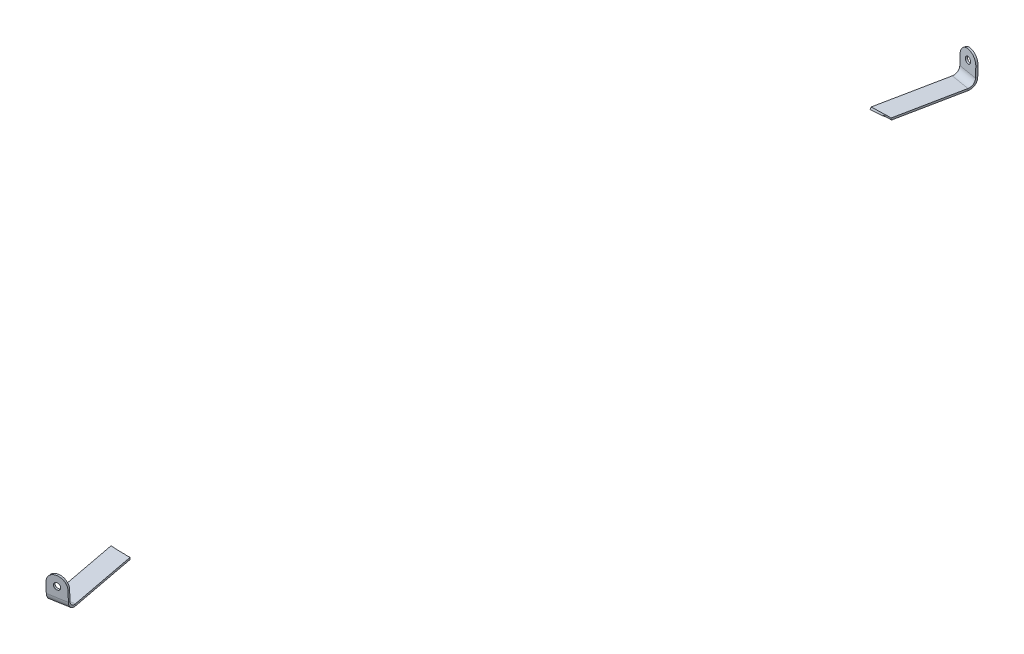
ISO-10303-21;
HEADER;
FILE_DESCRIPTION(('STEP AP214'),'2;1');
FILE_NAME('part.step','',(''),(''),'','','');
FILE_SCHEMA(('AUTOMOTIVE_DESIGN { 1 0 10303 214 1 1 1 1 }'));
ENDSEC;
DATA;
#1=APPLICATION_CONTEXT('core data for automotive mechanical design processes');
#2=APPLICATION_PROTOCOL_DEFINITION('international standard','automotive_design',2000,#1);
#3=PRODUCT_CONTEXT('',#1,'mechanical');
#4=PRODUCT('Part','Part','',(#3));
#5=PRODUCT_RELATED_PRODUCT_CATEGORY('part','',(#4));
#6=PRODUCT_DEFINITION_FORMATION('','',#4);
#7=PRODUCT_DEFINITION_CONTEXT('part definition',#1,'design');
#8=PRODUCT_DEFINITION('design','',#6,#7);
#9=PRODUCT_DEFINITION_SHAPE('','',#8);
#10=(LENGTH_UNIT() NAMED_UNIT(*) SI_UNIT(.MILLI.,.METRE.));
#11=(NAMED_UNIT(*) PLANE_ANGLE_UNIT() SI_UNIT($,.RADIAN.));
#12=(NAMED_UNIT(*) SI_UNIT($,.STERADIAN.) SOLID_ANGLE_UNIT());
#13=UNCERTAINTY_MEASURE_WITH_UNIT(LENGTH_MEASURE(1.E-05),#10,'distance_accuracy_value','');
#14=(GEOMETRIC_REPRESENTATION_CONTEXT(3) GLOBAL_UNCERTAINTY_ASSIGNED_CONTEXT((#13)) GLOBAL_UNIT_ASSIGNED_CONTEXT((#10,
#11,#12)) REPRESENTATION_CONTEXT('',''));
#15=CARTESIAN_POINT('',(0.,0.,0.));
#16=DIRECTION('',(0.,0.,1.));
#17=DIRECTION('',(1.,0.,0.));
#18=AXIS2_PLACEMENT_3D('',#15,#16,#17);
#19=CARTESIAN_POINT('',(-454.575221179992,354.525423143221,240.500641187299));
#20=DIRECTION('',(0.0609657391469297,-0.985926788350095,0.155664853656615));
#21=DIRECTION('',(0.,0.155954951815569,0.987764168718528));
#22=AXIS2_PLACEMENT_3D('',#19,#20,#21);
#23=CYLINDRICAL_SURFACE('',#22,12.7);
#24=CARTESIAN_POINT('',(-437.155744575564,72.8208319473103,284.978085639631));
#25=DIRECTION('',(0.,0.999631046205767,0.0271619487806516));
#26=DIRECTION('',(0.317023420960302,-0.0257608732319121,0.948067786591738));
#27=AXIS2_PLACEMENT_3D('',#24,#25,#26);
#28=ELLIPSE('',#27,12.9415558727378,12.7);
#29=CARTESIAN_POINT('',(-435.134039824026,72.473815444945,297.74920424056));
#30=VERTEX_POINT('',#29);
#31=CARTESIAN_POINT('',(-439.015321000394,72.4743381705257,297.729966566488));
#32=VERTEX_POINT('',#31);
#33=EDGE_CURVE('E166',#30,#32,#28,.F.);
#34=ORIENTED_EDGE('',*,*,#33,.F.);
#35=CARTESIAN_POINT('',(-437.14716187275,72.6820340463752,285.));
#36=DIRECTION('',(-0.68633491047864,-0.720841644542401,0.0966007978832687));
#37=DIRECTION('',(0.726913662599448,-0.675658315797391,0.122810290367253));
#38=AXIS2_PLACEMENT_3D('',#35,#36,#37);
#39=ELLIPSE('',#38,18.5701965904078,12.7000000000001);
#40=CARTESIAN_POINT('',(-434.743022917673,72.1011972708238,297.746821817143));
#41=VERTEX_POINT('',#40);
#42=EDGE_CURVE('E80',#30,#41,#39,.F.);
#43=ORIENTED_EDGE('',*,*,#42,.T.);
#44=CARTESIAN_POINT('',(-436.638137968157,64.4501925158768,286.29969935122));
#45=DIRECTION('',(-0.98607036337252,-0.00451781179628869,0.166267338509281));
#46=DIRECTION('',(0.0316142938172328,-0.986498873323067,0.16068761420457));
#47=AXIS2_PLACEMENT_3D('',#44,#45,#46);
#48=ELLIPSE('',#47,426.456473639011,12.7);
#49=CARTESIAN_POINT('',(-434.706648450076,70.9683013451794,297.931762372394));
#50=VERTEX_POINT('',#49);
#51=EDGE_CURVE('E244',#41,#50,#48,.F.);
#52=ORIENTED_EDGE('',*,*,#51,.T.);
#53=CARTESIAN_POINT('',(-437.062556600821,71.3138130554369,285.216024072823));
#54=DIRECTION('',(0.,0.999631046205767,0.0271619487806516));
#55=DIRECTION('',(0.317023420960302,-0.0257608732319121,0.948067786591738));
#56=AXIS2_PLACEMENT_3D('',#53,#54,#55);
#57=ELLIPSE('',#56,12.9415558727378,12.7);
#58=CARTESIAN_POINT('',(-440.880925780828,70.9803334096441,297.488950802206));
#59=VERTEX_POINT('',#58);
#60=EDGE_CURVE('E177',#50,#59,#57,.F.);
#61=ORIENTED_EDGE('',*,*,#60,.T.);
#62=CARTESIAN_POINT('',(-437.147161872749,72.6820340463746,285.));
#63=DIRECTION('',(-0.617048223658441,0.783072263279084,-0.077777375649579));
#64=DIRECTION('',(-0.782914510019822,-0.600931102063593,0.161017640564808));
#65=AXIS2_PLACEMENT_3D('',#62,#63,#64);
#66=ELLIPSE('',#65,15.4542968259917,12.7);
#67=EDGE_CURVE('E172',#32,#59,#66,.F.);
#68=ORIENTED_EDGE('',*,*,#67,.F.);
#69=EDGE_LOOP('',(#34,#43,#52,#61,#68));
#70=FACE_BOUND('',#69,.T.);
#71=ADVANCED_FACE('F71',(#70),#23,.F.);
#72=CARTESIAN_POINT('',(-425.21405512395,69.4397272385906,354.187303744331));
#73=DIRECTION('',(0.98607036337252,0.00451781179628869,-0.166267338509281));
#74=DIRECTION('',(0.166269035345273,0.,0.986080426681999));
#75=AXIS2_PLACEMENT_3D('',#72,#73,#74);
#76=PLANE('',#75);
#77=DIRECTION('',(-0.166328706116492,0.0267835927040429,-0.985706548970574));
#78=VECTOR('',#77,1.);
#79=CARTESIAN_POINT('',(-471.210528296626,78.3458977104861,81.6411559590432));
#80=LINE('',#79,#78);
#81=CARTESIAN_POINT('',(-434.742774799832,72.4735652713372,297.758411286322));
#82=VERTEX_POINT('',#81);
#83=CARTESIAN_POINT('',(-426.045698654532,71.0730917714194,349.29951392265));
#84=VERTEX_POINT('',#83);
#85=EDGE_CURVE('E162',#82,#84,#80,.F.);
#86=ORIENTED_EDGE('',*,*,#85,.T.);
#87=DIRECTION('',(0.,-0.999631046205767,-0.0271619487806516));
#88=VECTOR('',#87,1.);
#89=CARTESIAN_POINT('',(-426.045698654532,71.0730917714195,349.29951392265));
#90=LINE('',#89,#88);
#91=CARTESIAN_POINT('',(-426.045698654532,69.5736452021108,349.258770999479));
#92=VERTEX_POINT('',#91);
#93=EDGE_CURVE('E195',#84,#92,#90,.T.);
#94=ORIENTED_EDGE('',*,*,#93,.T.);
#95=DIRECTION('',(0.166328706116492,-0.0267835927040429,0.985706548970574));
#96=VECTOR('',#95,1.);
#97=CARTESIAN_POINT('',(-425.21405512395,69.4397272385906,354.187303744331));
#98=LINE('',#97,#96);
#99=EDGE_CURVE('E255',#50,#92,#98,.T.);
#100=ORIENTED_EDGE('',*,*,#99,.F.);
#101=ORIENTED_EDGE('',*,*,#51,.F.);
#102=CARTESIAN_POINT('',(-436.893998540833,72.6820411849469,285.005960083017));
#103=DIRECTION('',(-0.98607036337252,-0.00451781179628869,0.166267338509281));
#104=DIRECTION('',(0.166327674183448,-0.0232621817616968,0.985796112642168));
#105=AXIS2_PLACEMENT_3D('',#102,#103,#104);
#106=ELLIPSE('',#105,12.9343169742472,12.7000000000001);
#107=EDGE_CURVE('E174',#82,#41,#106,.F.);
#108=ORIENTED_EDGE('',*,*,#107,.F.);
#109=EDGE_LOOP('',(#86,#94,#100,#101,#108));
#110=FACE_BOUND('',#109,.T.);
#111=ADVANCED_FACE('F252',(#110),#76,.T.);
#112=CARTESIAN_POINT('',(0.,80.5048110724018,2.18747463200989));
#113=DIRECTION('',(0.,-0.999631046205767,-0.0271619487806516));
#114=DIRECTION('',(0.,-0.0271619487806516,0.999631046205767));
#115=AXIS2_PLACEMENT_3D('',#112,#113,#114);
#116=PLANE('',#115);
#117=CARTESIAN_POINT('',(-437.583576476735,72.8198902261302,285.012743452152));
#118=DIRECTION('',(0.,0.999631046205767,0.0271619487806516));
#119=DIRECTION('',(0.99978769088877,0.000559676648990314,-0.020597570472012));
#120=AXIS2_PLACEMENT_3D('',#117,#118,#119);
#121=ELLIPSE('',#120,42.0890580143291,12.7);
#122=CARTESIAN_POINT('',(-450.019155275822,72.4839490528952,297.376260855724));
#123=VERTEX_POINT('',#122);
#124=EDGE_CURVE('E14',#32,#123,#121,.F.);
#125=ORIENTED_EDGE('',*,*,#124,.T.);
#126=DIRECTION('',(0.166328706116492,-0.0267835927040429,0.985706548970574));
#127=VECTOR('',#126,1.);
#128=CARTESIAN_POINT('',(-486.001583747213,78.2781305335418,84.1351660366824));
#129=LINE('',#128,#127);
#130=CARTESIAN_POINT('',(-440.83675410512,71.0053245944751,351.793524000289));
#131=VERTEX_POINT('',#130);
#132=EDGE_CURVE('E155',#131,#123,#129,.F.);
#133=ORIENTED_EDGE('',*,*,#132,.F.);
#134=DIRECTION('',(-0.98607036337252,-0.00451781179628871,0.166267338509281));
#135=VECTOR('',#134,1.);
#136=CARTESIAN_POINT('',(-440.83675410512,71.0053245944751,351.793524000289));
#137=LINE('',#136,#135);
#138=EDGE_CURVE('E185',#131,#84,#137,.F.);
#139=ORIENTED_EDGE('',*,*,#138,.T.);
#140=ORIENTED_EDGE('',*,*,#85,.F.);
#141=CARTESIAN_POINT('',(-230.223854808945,72.6878687651985,289.87147992127));
#142=DIRECTION('',(0.,0.999631046205767,0.0271619487806516));
#143=DIRECTION('',(0.999723214152043,-0.000639024943334067,0.0235177960836197));
#144=AXIS2_PLACEMENT_3D('',#141,#142,#143);
#145=ELLIPSE('',#144,19027.3361564429,12.7000000000001);
#146=EDGE_CURVE('E168',#82,#30,#145,.F.);
#147=ORIENTED_EDGE('',*,*,#146,.T.);
#148=ORIENTED_EDGE('',*,*,#33,.T.);
#149=EDGE_LOOP('',(#125,#133,#139,#140,#147,#148));
#150=FACE_BOUND('',#149,.T.);
#151=ADVANCED_FACE('F73',(#150),#116,.F.);
#152=CARTESIAN_POINT('',(-424.964562064775,83.7771333763223,356.05653083898));
#153=DIRECTION('',(0.98607036337252,0.00451781179628892,-0.166267338509281));
#154=DIRECTION('',(0.,-0.999631046205767,-0.0271619487806558));
#155=AXIS2_PLACEMENT_3D('',#152,#153,#154);
#156=PLANE('',#155);
#157=DIRECTION('',(0.,-0.999631046205767,-0.0271619487806558));
#158=VECTOR('',#157,1.);
#159=CARTESIAN_POINT('',(-425.21405512395,83.8173087653783,354.577971015524));
#160=LINE('',#159,#158);
#161=CARTESIAN_POINT('',(-425.21405512395,83.8173087653783,354.577971015524));
#162=VERTEX_POINT('',#161);
#163=CARTESIAN_POINT('',(-425.21405512395,75.9373290389281,354.363856411406));
#164=VERTEX_POINT('',#163);
#165=EDGE_CURVE('E161',#162,#164,#160,.T.);
#166=ORIENTED_EDGE('',*,*,#165,.F.);
#167=DIRECTION('',(0.166328706116492,-0.0267835927040463,0.985706548970573));
#168=VECTOR('',#167,1.);
#169=CARTESIAN_POINT('',(-424.964562064775,83.7771333763223,356.05653083898));
#170=LINE('',#169,#168);
#171=CARTESIAN_POINT('',(-424.964562064775,83.7771333763223,356.05653083898));
#172=VERTEX_POINT('',#171);
#173=EDGE_CURVE('E215',#162,#172,#170,.T.);
#174=ORIENTED_EDGE('',*,*,#173,.T.);
#175=DIRECTION('',(0.,-0.999631046205767,-0.0271619487806558));
#176=VECTOR('',#175,1.);
#177=CARTESIAN_POINT('',(-424.964562064775,83.7771333763223,356.05653083898));
#178=LINE('',#177,#176);
#179=CARTESIAN_POINT('',(-424.964562064775,75.897153649872,355.842416234862));
#180=VERTEX_POINT('',#179);
#181=EDGE_CURVE('E191',#172,#180,#178,.T.);
#182=ORIENTED_EDGE('',*,*,#181,.T.);
#183=DIRECTION('',(0.166328706116496,-0.0267835927040465,0.985706548970573));
#184=VECTOR('',#183,1.);
#185=CARTESIAN_POINT('',(-425.21405512395,75.9373290389281,354.363856411406));
#186=LINE('',#185,#184);
#187=EDGE_CURVE('E209',#164,#180,#186,.T.);
#188=ORIENTED_EDGE('',*,*,#187,.F.);
#189=EDGE_LOOP('',(#166,#174,#182,#188));
#190=FACE_BOUND('',#189,.T.);
#191=ADVANCED_FACE('F285',(#190),#156,.T.);
#192=CARTESIAN_POINT('',(-432.360089790069,83.7432497878501,357.303535877799));
#193=DIRECTION('',(0.166328706116492,-0.0267835927040463,0.985706548970573));
#194=DIRECTION('',(-0.986060292941571,0.,0.166388397083397));
#195=AXIS2_PLACEMENT_3D('',#192,#193,#194);
#196=PLANE('',#195);
#197=CARTESIAN_POINT('',(-432.360089790069,83.7432497878501,357.303535877799));
#198=DIRECTION('',(-0.166328706116492,0.0267835927040463,-0.985706548970573));
#199=DIRECTION('',(-0.986060292941571,0.,0.166388397083397));
#200=AXIS2_PLACEMENT_3D('',#197,#198,#199);
#201=CIRCLE('',#200,2.5);
#202=CARTESIAN_POINT('',(-434.825240522423,83.7432497878501,357.719506870508));
#203=VERTEX_POINT('',#202);
#204=EDGE_CURVE('E208',#203,#203,#201,.T.);
#205=ORIENTED_EDGE('',*,*,#204,.T.);
#206=EDGE_LOOP('',(#205));
#207=FACE_BOUND('',#206,.T.);
#208=ORIENTED_EDGE('',*,*,#181,.F.);
#209=CARTESIAN_POINT('',(-432.360089790069,83.7432497878501,357.303535877799));
#210=DIRECTION('',(-0.166328706116492,0.0267835927040463,-0.985706548970573));
#211=DIRECTION('',(-0.986060292941571,0.,0.166388397083397));
#212=AXIS2_PLACEMENT_3D('',#209,#210,#211);
#213=CIRCLE('',#212,7.49999999999999);
#214=CARTESIAN_POINT('',(-439.755617515363,83.7093661993779,358.550540916619));
#215=VERTEX_POINT('',#214);
#216=EDGE_CURVE('E216',#215,#172,#213,.T.);
#217=ORIENTED_EDGE('',*,*,#216,.F.);
#218=DIRECTION('',(0.,0.999631046205767,0.0271619487806558));
#219=VECTOR('',#218,1.);
#220=CARTESIAN_POINT('',(-439.755617515363,69.3317846725901,358.159873645426));
#221=LINE('',#220,#219);
#222=CARTESIAN_POINT('',(-439.755617515363,75.8293864729277,358.336426312501));
#223=VERTEX_POINT('',#222);
#224=EDGE_CURVE('E190',#223,#215,#221,.T.);
#225=ORIENTED_EDGE('',*,*,#224,.F.);
#226=DIRECTION('',(0.986070363372519,0.004517811796289,-0.166267338509284));
#227=VECTOR('',#226,1.);
#228=CARTESIAN_POINT('',(-424.964562064775,75.897153649872,355.842416234862));
#229=LINE('',#228,#227);
#230=EDGE_CURVE('E187',#180,#223,#229,.F.);
#231=ORIENTED_EDGE('',*,*,#230,.F.);
#232=EDGE_LOOP('',(#208,#217,#225,#231));
#233=FACE_BOUND('',#232,.T.);
#234=ADVANCED_FACE('F289',(#207,#233),#196,.T.);
#235=CARTESIAN_POINT('',(-432.609582849244,83.7834251769061,355.824976054343));
#236=DIRECTION('',(0.166328706116492,-0.0267835927040463,0.985706548970573));
#237=DIRECTION('',(-0.986060292941571,0.,0.166388397083397));
#238=AXIS2_PLACEMENT_3D('',#235,#236,#237);
#239=PLANE('',#238);
#240=CARTESIAN_POINT('',(-432.609582849244,83.7834251769061,355.824976054343));
#241=DIRECTION('',(-0.166328706116492,0.0267835927040463,-0.985706548970573));
#242=DIRECTION('',(-0.986060292941571,0.,0.166388397083397));
#243=AXIS2_PLACEMENT_3D('',#240,#241,#242);
#244=CIRCLE('',#243,2.5);
#245=CARTESIAN_POINT('',(-435.074733581598,83.7834251769061,356.240947047052));
#246=VERTEX_POINT('',#245);
#247=EDGE_CURVE('E219',#246,#246,#244,.T.);
#248=ORIENTED_EDGE('',*,*,#247,.F.);
#249=EDGE_LOOP('',(#248));
#250=FACE_BOUND('',#249,.T.);
#251=DIRECTION('',(0.986070363372519,0.004517811796289,-0.166267338509284));
#252=VECTOR('',#251,1.);
#253=CARTESIAN_POINT('',(-425.21405512395,75.9373290389281,354.363856411406));
#254=LINE('',#253,#252);
#255=CARTESIAN_POINT('',(-440.005110574538,75.8695618619837,356.857866489045));
#256=VERTEX_POINT('',#255);
#257=EDGE_CURVE('E199',#164,#256,#254,.F.);
#258=ORIENTED_EDGE('',*,*,#257,.T.);
#259=DIRECTION('',(0.,0.999631046205767,0.0271619487806558));
#260=VECTOR('',#259,1.);
#261=CARTESIAN_POINT('',(-440.005110574538,69.3719600616462,356.681313821971));
#262=LINE('',#261,#260);
#263=CARTESIAN_POINT('',(-440.005110574538,83.749541588434,357.071981093163));
#264=VERTEX_POINT('',#263);
#265=EDGE_CURVE('E229',#256,#264,#262,.T.);
#266=ORIENTED_EDGE('',*,*,#265,.T.);
#267=CARTESIAN_POINT('',(-432.609582849244,83.7834251769061,355.824976054343));
#268=DIRECTION('',(-0.166328706116492,0.0267835927040463,-0.985706548970573));
#269=DIRECTION('',(-0.986060292941571,0.,0.166388397083397));
#270=AXIS2_PLACEMENT_3D('',#267,#268,#269);
#271=CIRCLE('',#270,7.49999999999999);
#272=EDGE_CURVE('E230',#264,#162,#271,.T.);
#273=ORIENTED_EDGE('',*,*,#272,.T.);
#274=ORIENTED_EDGE('',*,*,#165,.T.);
#275=EDGE_LOOP('',(#258,#266,#273,#274));
#276=FACE_BOUND('',#275,.T.);
#277=ADVANCED_FACE('F280',(#250,#276),#239,.F.);
#278=CARTESIAN_POINT('',(-439.755617515363,69.3317846725901,358.159873645426));
#279=DIRECTION('',(-0.98607036337252,-0.00451781179628892,0.166267338509281));
#280=DIRECTION('',(0.,0.999631046205767,0.0271619487806558));
#281=AXIS2_PLACEMENT_3D('',#278,#279,#280);
#282=PLANE('',#281);
#283=DIRECTION('',(0.166328706116496,-0.0267835927040455,0.985706548970573));
#284=VECTOR('',#283,1.);
#285=CARTESIAN_POINT('',(-440.005110574538,75.8695618619837,356.857866489045));
#286=LINE('',#285,#284);
#287=EDGE_CURVE('E196',#256,#223,#286,.T.);
#288=ORIENTED_EDGE('',*,*,#287,.T.);
#289=ORIENTED_EDGE('',*,*,#224,.T.);
#290=DIRECTION('',(0.166328706116492,-0.0267835927040463,0.985706548970573));
#291=VECTOR('',#290,1.);
#292=CARTESIAN_POINT('',(-439.755617515363,83.7093661993779,358.550540916619));
#293=LINE('',#292,#291);
#294=EDGE_CURVE('E233',#264,#215,#293,.T.);
#295=ORIENTED_EDGE('',*,*,#294,.F.);
#296=ORIENTED_EDGE('',*,*,#265,.F.);
#297=EDGE_LOOP('',(#288,#289,#295,#296));
#298=FACE_BOUND('',#297,.T.);
#299=ADVANCED_FACE('F276',(#298),#282,.T.);
#300=CARTESIAN_POINT('',(-432.360089790069,83.7432497878501,357.303535877799));
#301=DIRECTION('',(0.166328706116492,-0.0267835927040463,0.985706548970573));
#302=DIRECTION('',(-0.986060292941571,0.,0.166388397083397));
#303=AXIS2_PLACEMENT_3D('',#300,#301,#302);
#304=CYLINDRICAL_SURFACE('',#303,7.49999999999999);
#305=ORIENTED_EDGE('',*,*,#294,.T.);
#306=ORIENTED_EDGE('',*,*,#216,.T.);
#307=ORIENTED_EDGE('',*,*,#173,.F.);
#308=ORIENTED_EDGE('',*,*,#272,.F.);
#309=EDGE_LOOP('',(#305,#306,#307,#308));
#310=FACE_BOUND('',#309,.T.);
#311=ADVANCED_FACE('F291',(#310),#304,.T.);
#312=CARTESIAN_POINT('',(-432.360089790069,83.7432497878501,357.303535877799));
#313=DIRECTION('',(0.166328706116492,-0.0267835927040463,0.985706548970573));
#314=DIRECTION('',(-0.986060292941571,0.,0.166388397083397));
#315=AXIS2_PLACEMENT_3D('',#312,#313,#314);
#316=CYLINDRICAL_SURFACE('',#315,2.5);
#317=ORIENTED_EDGE('',*,*,#204,.F.);
#318=EDGE_LOOP('',(#317));
#319=FACE_BOUND('',#318,.T.);
#320=ORIENTED_EDGE('',*,*,#247,.T.);
#321=EDGE_LOOP('',(#320));
#322=FACE_BOUND('',#321,.T.);
#323=ADVANCED_FACE('F293',(#319,#322),#316,.F.);
#324=CARTESIAN_POINT('',(-440.83675410512,76.003479825504,351.929333744192));
#325=DIRECTION('',(-0.986070363372519,-0.004517811796289,0.166267338509284));
#326=DIRECTION('',(-0.166269035345277,0.,-0.986080426681998));
#327=AXIS2_PLACEMENT_3D('',#324,#325,#326);
#328=PLANE('',#327);
#329=DIRECTION('',(0.,-0.999631046205767,-0.0271619487806516));
#330=VECTOR('',#329,1.);
#331=CARTESIAN_POINT('',(-440.83675410512,69.5058780251665,351.752781077118));
#332=LINE('',#331,#330);
#333=CARTESIAN_POINT('',(-440.83675410512,69.5058780251665,351.752781077118));
#334=VERTEX_POINT('',#333);
#335=EDGE_CURVE('E151',#131,#334,#332,.T.);
#336=ORIENTED_EDGE('',*,*,#335,.T.);
#337=CARTESIAN_POINT('',(-440.83675410512,76.003479825504,351.929333744192));
#338=DIRECTION('',(-0.986070363372519,-0.004517811796289,0.166267338509284));
#339=DIRECTION('',(0.166269035345277,0.,0.986080426681998));
#340=AXIS2_PLACEMENT_3D('',#337,#338,#339);
#341=CIRCLE('',#340,6.5);
#342=EDGE_CURVE('E192',#223,#334,#341,.F.);
#343=ORIENTED_EDGE('',*,*,#342,.F.);
#344=ORIENTED_EDGE('',*,*,#287,.F.);
#345=CARTESIAN_POINT('',(-440.83675410512,76.003479825504,351.929333744192));
#346=DIRECTION('',(-0.986070363372519,-0.004517811796289,0.166267338509284));
#347=DIRECTION('',(0.166269035345277,0.,0.986080426681998));
#348=AXIS2_PLACEMENT_3D('',#345,#346,#347);
#349=CIRCLE('',#348,5.);
#350=EDGE_CURVE('E200',#256,#131,#349,.F.);
#351=ORIENTED_EDGE('',*,*,#350,.T.);
#352=EDGE_LOOP('',(#336,#343,#344,#351));
#353=FACE_BOUND('',#352,.T.);
#354=ADVANCED_FACE('F273',(#353),#328,.T.);
#355=CARTESIAN_POINT('',(-426.045698654532,76.0712470024483,349.435323666553));
#356=DIRECTION('',(-0.986070363372519,-0.004517811796289,0.166267338509284));
#357=DIRECTION('',(-0.166269035345277,0.,-0.986080426681998));
#358=AXIS2_PLACEMENT_3D('',#355,#356,#357);
#359=PLANE('',#358);
#360=CARTESIAN_POINT('',(-426.045698654532,76.0712470024483,349.435323666553));
#361=DIRECTION('',(-0.986070363372519,-0.004517811796289,0.166267338509284));
#362=DIRECTION('',(0.166269035345277,0.,0.986080426681998));
#363=AXIS2_PLACEMENT_3D('',#360,#361,#362);
#364=CIRCLE('',#363,5.);
#365=EDGE_CURVE('E204',#84,#164,#364,.T.);
#366=ORIENTED_EDGE('',*,*,#365,.T.);
#367=ORIENTED_EDGE('',*,*,#187,.T.);
#368=CARTESIAN_POINT('',(-426.045698654532,76.0712470024483,349.435323666553));
#369=DIRECTION('',(-0.986070363372519,-0.004517811796289,0.166267338509284));
#370=DIRECTION('',(0.166269035345277,0.,0.986080426681998));
#371=AXIS2_PLACEMENT_3D('',#368,#369,#370);
#372=CIRCLE('',#371,6.5);
#373=EDGE_CURVE('E197',#92,#180,#372,.T.);
#374=ORIENTED_EDGE('',*,*,#373,.F.);
#375=ORIENTED_EDGE('',*,*,#93,.F.);
#376=EDGE_LOOP('',(#366,#367,#374,#375));
#377=FACE_BOUND('',#376,.T.);
#378=ADVANCED_FACE('F263',(#377),#359,.F.);
#379=CARTESIAN_POINT('',(-426.045698654532,76.0712470024483,349.435323666553));
#380=DIRECTION('',(0.986070363372519,0.004517811796289,-0.166267338509284));
#381=DIRECTION('',(0.,-0.999631046205768,-0.0271619487806517));
#382=AXIS2_PLACEMENT_3D('',#379,#380,#381);
#383=CYLINDRICAL_SURFACE('',#382,6.5);
#384=ORIENTED_EDGE('',*,*,#230,.T.);
#385=ORIENTED_EDGE('',*,*,#342,.T.);
#386=DIRECTION('',(0.98607036337252,0.00451781179628871,-0.166267338509281));
#387=VECTOR('',#386,1.);
#388=CARTESIAN_POINT('',(45.1648296420933,71.7325585640264,269.805089672445));
#389=LINE('',#388,#387);
#390=EDGE_CURVE('E180',#334,#92,#389,.T.);
#391=ORIENTED_EDGE('',*,*,#390,.T.);
#392=ORIENTED_EDGE('',*,*,#373,.T.);
#393=EDGE_LOOP('',(#384,#385,#391,#392));
#394=FACE_BOUND('',#393,.T.);
#395=ADVANCED_FACE('F270',(#394),#383,.T.);
#396=CARTESIAN_POINT('',(-426.045698654532,76.0712470024483,349.435323666553));
#397=DIRECTION('',(0.986070363372519,0.004517811796289,-0.166267338509284));
#398=DIRECTION('',(0.,-0.999631046205768,-0.0271619487806517));
#399=AXIS2_PLACEMENT_3D('',#396,#397,#398);
#400=CYLINDRICAL_SURFACE('',#399,5.);
#401=ORIENTED_EDGE('',*,*,#257,.F.);
#402=ORIENTED_EDGE('',*,*,#365,.F.);
#403=ORIENTED_EDGE('',*,*,#138,.F.);
#404=ORIENTED_EDGE('',*,*,#350,.F.);
#405=EDGE_LOOP('',(#401,#402,#403,#404));
#406=FACE_BOUND('',#405,.T.);
#407=ADVANCED_FACE('F283',(#406),#400,.F.);
#408=CARTESIAN_POINT('',(-453.560900123032,71.5548228670257,276.346230080869));
#409=DIRECTION('',(-0.98607036337252,-0.00451781179628869,0.166267338509281));
#410=DIRECTION('',(-0.166269035345273,0.,-0.986080426681999));
#411=AXIS2_PLACEMENT_3D('',#408,#409,#410);
#412=PLANE('',#411);
#413=DIRECTION('',(-0.166328706116492,0.0267835927040429,-0.985706548970574));
#414=VECTOR('',#413,1.);
#415=CARTESIAN_POINT('',(-453.560900123032,71.5548228670257,276.346230080869));
#416=LINE('',#415,#414);
#417=CARTESIAN_POINT('',(-450.113376353857,70.9996747231665,296.777139671586));
#418=VERTEX_POINT('',#417);
#419=EDGE_CURVE('E75',#334,#418,#416,.T.);
#420=ORIENTED_EDGE('',*,*,#419,.F.);
#421=ORIENTED_EDGE('',*,*,#335,.F.);
#422=ORIENTED_EDGE('',*,*,#132,.T.);
#423=CARTESIAN_POINT('',(-452.055074028709,77.3911977617537,285.435316012605));
#424=DIRECTION('',(0.98607036337252,0.00451781179628869,-0.166267338509281));
#425=DIRECTION('',(0.0696626886194012,-0.918949393737597,0.388174086671971));
#426=AXIS2_PLACEMENT_3D('',#423,#424,#425);
#427=ELLIPSE('',#426,13.4651231277329,12.7);
#428=EDGE_CURVE('E147',#418,#123,#427,.F.);
#429=ORIENTED_EDGE('',*,*,#428,.F.);
#430=EDGE_LOOP('',(#420,#421,#422,#429));
#431=FACE_BOUND('',#430,.T.);
#432=ADVANCED_FACE('F156',(#431),#412,.T.);
#433=CARTESIAN_POINT('',(0.,79.0053645030931,2.14673170883891));
#434=DIRECTION('',(0.,-0.999631046205767,-0.0271619487806516));
#435=DIRECTION('',(0.,-0.0271619487806516,0.999631046205767));
#436=AXIS2_PLACEMENT_3D('',#433,#434,#435);
#437=PLANE('',#436);
#438=ORIENTED_EDGE('',*,*,#60,.F.);
#439=ORIENTED_EDGE('',*,*,#99,.T.);
#440=ORIENTED_EDGE('',*,*,#390,.F.);
#441=ORIENTED_EDGE('',*,*,#419,.T.);
#442=CARTESIAN_POINT('',(-432.845139883224,71.3230962122974,284.87437952149));
#443=DIRECTION('',(0.,0.999631046205767,0.0271619487806516));
#444=DIRECTION('',(0.99978769088877,0.000559676648990314,-0.020597570472012));
#445=AXIS2_PLACEMENT_3D('',#442,#443,#444);
#446=ELLIPSE('',#445,42.0890580143291,12.7);
#447=EDGE_CURVE('E95',#59,#418,#446,.F.);
#448=ORIENTED_EDGE('',*,*,#447,.F.);
#449=EDGE_LOOP('',(#438,#439,#440,#441,#448));
#450=FACE_BOUND('',#449,.T.);
#451=ADVANCED_FACE('F269',(#450),#437,.T.);
#452=CARTESIAN_POINT('',(-437.147161872751,72.6820340463752,285.));
#453=DIRECTION('',(0.999722991461748,2.81896836037487E-05,0.0235359203796016));
#454=DIRECTION('',(-0.0235359203889531,0.,0.999722991858968));
#455=AXIS2_PLACEMENT_3D('',#452,#453,#454);
#456=CYLINDRICAL_SURFACE('',#455,12.7000000000001);
#457=ORIENTED_EDGE('',*,*,#146,.F.);
#458=ORIENTED_EDGE('',*,*,#107,.T.);
#459=ORIENTED_EDGE('',*,*,#42,.F.);
#460=EDGE_LOOP('',(#457,#458,#459));
#461=FACE_BOUND('',#460,.T.);
#462=ADVANCED_FACE('F248',(#461),#456,.F.);
#463=CARTESIAN_POINT('',(-676.260714615963,148.214063927805,291.982195578493));
#464=DIRECTION('',(0.953187480336007,-0.301096213164722,-0.0278333926886372));
#465=DIRECTION('',(0.301212910252048,0.953556911095238,0.));
#466=AXIS2_PLACEMENT_3D('',#463,#464,#465);
#467=CYLINDRICAL_SURFACE('',#466,12.7);
#468=ORIENTED_EDGE('',*,*,#124,.F.);
#469=ORIENTED_EDGE('',*,*,#67,.T.);
#470=ORIENTED_EDGE('',*,*,#447,.T.);
#471=ORIENTED_EDGE('',*,*,#428,.T.);
#472=EDGE_LOOP('',(#468,#469,#470,#471));
#473=FACE_BOUND('',#472,.T.);
#474=ADVANCED_FACE('F149',(#473),#467,.F.);
#475=CLOSED_SHELL('',(#71,#111,#151,#191,#234,#277,#299,#311,#323,#354,#378,#395,#407,#432,#451,
#462,#474));
#476=MANIFOLD_SOLID_BREP('B2',#475);
#477=CARTESIAN_POINT('',(-454.575221179992,354.525423143221,-240.500641187299));
#478=DIRECTION('',(0.0609657391469297,-0.985926788350095,-0.155664853656615));
#479=DIRECTION('',(0.,0.155954951815569,-0.987764168718528));
#480=AXIS2_PLACEMENT_3D('',#477,#478,#479);
#481=CYLINDRICAL_SURFACE('',#480,12.7);
#482=CARTESIAN_POINT('',(-437.155744575564,72.8208319473103,-284.978085639631));
#483=DIRECTION('',(0.,-0.999631046205767,0.0271619487806516));
#484=DIRECTION('',(0.317023420960302,-0.0257608732319121,-0.948067786591738));
#485=AXIS2_PLACEMENT_3D('',#482,#483,#484);
#486=ELLIPSE('',#485,12.9415558727378,12.7);
#487=CARTESIAN_POINT('',(-435.134039824026,72.473815444945,-297.74920424056));
#488=VERTEX_POINT('',#487);
#489=CARTESIAN_POINT('',(-439.015321000394,72.4743381705257,-297.729966566488));
#490=VERTEX_POINT('',#489);
#491=EDGE_CURVE('E600',#488,#490,#486,.F.);
#492=ORIENTED_EDGE('',*,*,#491,.T.);
#493=CARTESIAN_POINT('',(-437.147161872749,72.6820340463746,-285.));
#494=DIRECTION('',(0.617048223658441,-0.783072263279084,-0.077777375649579));
#495=DIRECTION('',(-0.782914510019822,-0.600931102063593,-0.161017640564808));
#496=AXIS2_PLACEMENT_3D('',#493,#494,#495);
#497=ELLIPSE('',#496,15.4542968259917,12.7);
#498=CARTESIAN_POINT('',(-440.880925780828,70.9803334096441,-297.488950802206));
#499=VERTEX_POINT('',#498);
#500=EDGE_CURVE('E514',#490,#499,#497,.F.);
#501=ORIENTED_EDGE('',*,*,#500,.T.);
#502=CARTESIAN_POINT('',(-437.062556600821,71.3138130554369,-285.216024072823));
#503=DIRECTION('',(0.,-0.999631046205767,0.0271619487806516));
#504=DIRECTION('',(0.317023420960302,-0.0257608732319121,-0.948067786591738));
#505=AXIS2_PLACEMENT_3D('',#502,#503,#504);
#506=ELLIPSE('',#505,12.9415558727378,12.7);
#507=CARTESIAN_POINT('',(-434.706648450076,70.9683013451794,-297.931762372394));
#508=VERTEX_POINT('',#507);
#509=EDGE_CURVE('E602',#508,#499,#506,.F.);
#510=ORIENTED_EDGE('',*,*,#509,.F.);
#511=CARTESIAN_POINT('',(-436.638137968157,64.4501925158768,-286.29969935122));
#512=DIRECTION('',(0.98607036337252,0.00451781179628869,0.166267338509281));
#513=DIRECTION('',(0.0316142938172328,-0.986498873323067,-0.16068761420457));
#514=AXIS2_PLACEMENT_3D('',#511,#512,#513);
#515=ELLIPSE('',#514,426.456473639011,12.7);
#516=CARTESIAN_POINT('',(-434.743022917673,72.1011972708238,-297.746821817143));
#517=VERTEX_POINT('',#516);
#518=EDGE_CURVE('E669',#517,#508,#515,.F.);
#519=ORIENTED_EDGE('',*,*,#518,.F.);
#520=CARTESIAN_POINT('',(-437.14716187275,72.6820340463752,-285.));
#521=DIRECTION('',(0.68633491047864,0.720841644542401,0.0966007978832687));
#522=DIRECTION('',(0.726913662599448,-0.675658315797391,-0.122810290367253));
#523=AXIS2_PLACEMENT_3D('',#520,#521,#522);
#524=ELLIPSE('',#523,18.5701965904078,12.7000000000001);
#525=EDGE_CURVE('E507',#488,#517,#524,.F.);
#526=ORIENTED_EDGE('',*,*,#525,.F.);
#527=EDGE_LOOP('',(#492,#501,#510,#519,#526));
#528=FACE_BOUND('',#527,.T.);
#529=ADVANCED_FACE('F498',(#528),#481,.F.);
#530=CARTESIAN_POINT('',(-425.21405512395,69.4397272385906,-354.187303744331));
#531=DIRECTION('',(0.98607036337252,0.00451781179628869,0.166267338509281));
#532=DIRECTION('',(0.166269035345273,0.,-0.986080426681999));
#533=AXIS2_PLACEMENT_3D('',#530,#531,#532);
#534=PLANE('',#533);
#535=DIRECTION('',(-0.166328706116492,0.0267835927040429,0.985706548970574));
#536=VECTOR('',#535,1.);
#537=CARTESIAN_POINT('',(-471.210528296626,78.3458977104861,-81.6411559590432));
#538=LINE('',#537,#536);
#539=CARTESIAN_POINT('',(-434.742774799832,72.4735652713372,-297.758411286322));
#540=VERTEX_POINT('',#539);
#541=CARTESIAN_POINT('',(-426.045698654532,71.0730917714194,-349.29951392265));
#542=VERTEX_POINT('',#541);
#543=EDGE_CURVE('E591',#540,#542,#538,.F.);
#544=ORIENTED_EDGE('',*,*,#543,.F.);
#545=CARTESIAN_POINT('',(-436.893998540833,72.6820411849469,-285.005960083017));
#546=DIRECTION('',(0.98607036337252,0.00451781179628869,0.166267338509281));
#547=DIRECTION('',(0.166327674183448,-0.0232621817616968,-0.985796112642168));
#548=AXIS2_PLACEMENT_3D('',#545,#546,#547);
#549=ELLIPSE('',#548,12.9343169742472,12.7000000000001);
#550=EDGE_CURVE('E666',#540,#517,#549,.F.);
#551=ORIENTED_EDGE('',*,*,#550,.T.);
#552=ORIENTED_EDGE('',*,*,#518,.T.);
#553=DIRECTION('',(0.166328706116492,-0.0267835927040429,-0.985706548970574));
#554=VECTOR('',#553,1.);
#555=CARTESIAN_POINT('',(-425.21405512395,69.4397272385906,-354.187303744331));
#556=LINE('',#555,#554);
#557=CARTESIAN_POINT('',(-426.045698654532,69.5736452021108,-349.258770999479));
#558=VERTEX_POINT('',#557);
#559=EDGE_CURVE('E597',#508,#558,#556,.T.);
#560=ORIENTED_EDGE('',*,*,#559,.T.);
#561=DIRECTION('',(0.,-0.999631046205767,0.0271619487806516));
#562=VECTOR('',#561,1.);
#563=CARTESIAN_POINT('',(-426.045698654532,71.0730917714195,-349.29951392265));
#564=LINE('',#563,#562);
#565=EDGE_CURVE('E620',#542,#558,#564,.T.);
#566=ORIENTED_EDGE('',*,*,#565,.F.);
#567=EDGE_LOOP('',(#544,#551,#552,#560,#566));
#568=FACE_BOUND('',#567,.T.);
#569=ADVANCED_FACE('F680',(#568),#534,.T.);
#570=CARTESIAN_POINT('',(0.,80.5048110724018,-2.18747463200989));
#571=DIRECTION('',(0.,-0.999631046205767,0.0271619487806516));
#572=DIRECTION('',(0.,-0.0271619487806516,-0.999631046205767));
#573=AXIS2_PLACEMENT_3D('',#570,#571,#572);
#574=PLANE('',#573);
#575=CARTESIAN_POINT('',(-437.583576476735,72.8198902261302,-285.012743452152));
#576=DIRECTION('',(0.,-0.999631046205767,0.0271619487806516));
#577=DIRECTION('',(0.99978769088877,0.000559676648990314,0.020597570472012));
#578=AXIS2_PLACEMENT_3D('',#575,#576,#577);
#579=ELLIPSE('',#578,42.0890580143291,12.7);
#580=CARTESIAN_POINT('',(-450.019155275822,72.4839490528952,-297.376260855724));
#581=VERTEX_POINT('',#580);
#582=EDGE_CURVE('E69',#490,#581,#579,.F.);
#583=ORIENTED_EDGE('',*,*,#582,.F.);
#584=ORIENTED_EDGE('',*,*,#491,.F.);
#585=CARTESIAN_POINT('',(-230.223854808945,72.6878687651985,-289.87147992127));
#586=DIRECTION('',(0.,-0.999631046205767,0.0271619487806516));
#587=DIRECTION('',(0.999723214152043,-0.000639024943334067,-0.0235177960836197));
#588=AXIS2_PLACEMENT_3D('',#585,#586,#587);
#589=ELLIPSE('',#588,19027.3361564429,12.7000000000001);
#590=EDGE_CURVE('E670',#540,#488,#589,.F.);
#591=ORIENTED_EDGE('',*,*,#590,.F.);
#592=ORIENTED_EDGE('',*,*,#543,.T.);
#593=DIRECTION('',(-0.98607036337252,-0.00451781179628871,-0.166267338509281));
#594=VECTOR('',#593,1.);
#595=CARTESIAN_POINT('',(-440.83675410512,71.0053245944751,-351.793524000289));
#596=LINE('',#595,#594);
#597=CARTESIAN_POINT('',(-440.83675410512,71.0053245944751,-351.793524000289));
#598=VERTEX_POINT('',#597);
#599=EDGE_CURVE('E589',#598,#542,#596,.F.);
#600=ORIENTED_EDGE('',*,*,#599,.F.);
#601=DIRECTION('',(0.166328706116492,-0.0267835927040429,-0.985706548970574));
#602=VECTOR('',#601,1.);
#603=CARTESIAN_POINT('',(-486.001583747213,78.2781305335418,-84.1351660366824));
#604=LINE('',#603,#602);
#605=EDGE_CURVE('E583',#598,#581,#604,.F.);
#606=ORIENTED_EDGE('',*,*,#605,.T.);
#607=EDGE_LOOP('',(#583,#584,#591,#592,#600,#606));
#608=FACE_BOUND('',#607,.T.);
#609=ADVANCED_FACE('F500',(#608),#574,.F.);
#610=CARTESIAN_POINT('',(-424.964562064775,83.7771333763223,-356.05653083898));
#611=DIRECTION('',(0.98607036337252,0.00451781179628892,0.166267338509281));
#612=DIRECTION('',(0.,-0.999631046205767,0.0271619487806558));
#613=AXIS2_PLACEMENT_3D('',#610,#611,#612);
#614=PLANE('',#613);
#615=DIRECTION('',(0.,-0.999631046205767,0.0271619487806558));
#616=VECTOR('',#615,1.);
#617=CARTESIAN_POINT('',(-425.21405512395,83.8173087653783,-354.577971015524));
#618=LINE('',#617,#616);
#619=CARTESIAN_POINT('',(-425.21405512395,83.8173087653783,-354.577971015524));
#620=VERTEX_POINT('',#619);
#621=CARTESIAN_POINT('',(-425.21405512395,75.9373290389281,-354.363856411406));
#622=VERTEX_POINT('',#621);
#623=EDGE_CURVE('E590',#620,#622,#618,.T.);
#624=ORIENTED_EDGE('',*,*,#623,.T.);
#625=DIRECTION('',(0.166328706116496,-0.0267835927040465,-0.985706548970573));
#626=VECTOR('',#625,1.);
#627=CARTESIAN_POINT('',(-425.21405512395,75.9373290389281,-354.363856411406));
#628=LINE('',#627,#626);
#629=CARTESIAN_POINT('',(-424.964562064775,75.897153649872,-355.842416234862));
#630=VERTEX_POINT('',#629);
#631=EDGE_CURVE('E595',#622,#630,#628,.T.);
#632=ORIENTED_EDGE('',*,*,#631,.T.);
#633=DIRECTION('',(0.,-0.999631046205767,0.0271619487806558));
#634=VECTOR('',#633,1.);
#635=CARTESIAN_POINT('',(-424.964562064775,83.7771333763223,-356.05653083898));
#636=LINE('',#635,#634);
#637=CARTESIAN_POINT('',(-424.964562064775,83.7771333763223,-356.05653083898));
#638=VERTEX_POINT('',#637);
#639=EDGE_CURVE('E616',#638,#630,#636,.T.);
#640=ORIENTED_EDGE('',*,*,#639,.F.);
#641=DIRECTION('',(0.166328706116492,-0.0267835927040463,-0.985706548970573));
#642=VECTOR('',#641,1.);
#643=CARTESIAN_POINT('',(-424.964562064775,83.7771333763223,-356.05653083898));
#644=LINE('',#643,#642);
#645=EDGE_CURVE('E641',#620,#638,#644,.T.);
#646=ORIENTED_EDGE('',*,*,#645,.F.);
#647=EDGE_LOOP('',(#624,#632,#640,#646));
#648=FACE_BOUND('',#647,.T.);
#649=ADVANCED_FACE('F711',(#648),#614,.T.);
#650=CARTESIAN_POINT('',(-432.360089790069,83.7432497878501,-357.303535877799));
#651=DIRECTION('',(0.166328706116492,-0.0267835927040463,-0.985706548970573));
#652=DIRECTION('',(-0.986060292941571,0.,-0.166388397083397));
#653=AXIS2_PLACEMENT_3D('',#650,#651,#652);
#654=PLANE('',#653);
#655=CARTESIAN_POINT('',(-432.360089790069,83.7432497878501,-357.303535877799));
#656=DIRECTION('',(0.166328706116492,-0.0267835927040463,-0.985706548970573));
#657=DIRECTION('',(-0.986060292941571,0.,-0.166388397083397));
#658=AXIS2_PLACEMENT_3D('',#655,#656,#657);
#659=CIRCLE('',#658,2.5);
#660=CARTESIAN_POINT('',(-434.825240522423,83.7432497878501,-357.719506870508));
#661=VERTEX_POINT('',#660);
#662=EDGE_CURVE('E635',#661,#661,#659,.T.);
#663=ORIENTED_EDGE('',*,*,#662,.F.);
#664=EDGE_LOOP('',(#663));
#665=FACE_BOUND('',#664,.T.);
#666=ORIENTED_EDGE('',*,*,#639,.T.);
#667=DIRECTION('',(0.986070363372519,0.004517811796289,0.166267338509284));
#668=VECTOR('',#667,1.);
#669=CARTESIAN_POINT('',(-424.964562064775,75.897153649872,-355.842416234862));
#670=LINE('',#669,#668);
#671=CARTESIAN_POINT('',(-439.755617515363,75.8293864729277,-358.336426312501));
#672=VERTEX_POINT('',#671);
#673=EDGE_CURVE('E612',#630,#672,#670,.F.);
#674=ORIENTED_EDGE('',*,*,#673,.T.);
#675=DIRECTION('',(0.,0.999631046205767,-0.0271619487806558));
#676=VECTOR('',#675,1.);
#677=CARTESIAN_POINT('',(-439.755617515363,69.3317846725901,-358.159873645426));
#678=LINE('',#677,#676);
#679=CARTESIAN_POINT('',(-439.755617515363,83.7093661993779,-358.550540916619));
#680=VERTEX_POINT('',#679);
#681=EDGE_CURVE('E615',#672,#680,#678,.T.);
#682=ORIENTED_EDGE('',*,*,#681,.T.);
#683=CARTESIAN_POINT('',(-432.360089790069,83.7432497878501,-357.303535877799));
#684=DIRECTION('',(0.166328706116492,-0.0267835927040463,-0.985706548970573));
#685=DIRECTION('',(-0.986060292941571,0.,-0.166388397083397));
#686=AXIS2_PLACEMENT_3D('',#683,#684,#685);
#687=CIRCLE('',#686,7.49999999999999);
#688=EDGE_CURVE('E642',#680,#638,#687,.T.);
#689=ORIENTED_EDGE('',*,*,#688,.T.);
#690=EDGE_LOOP('',(#666,#674,#682,#689));
#691=FACE_BOUND('',#690,.T.);
#692=ADVANCED_FACE('F702',(#665,#691),#654,.T.);
#693=CARTESIAN_POINT('',(-432.609582849244,83.7834251769061,-355.824976054343));
#694=DIRECTION('',(0.166328706116492,-0.0267835927040463,-0.985706548970573));
#695=DIRECTION('',(-0.986060292941571,0.,-0.166388397083397));
#696=AXIS2_PLACEMENT_3D('',#693,#694,#695);
#697=PLANE('',#696);
#698=CARTESIAN_POINT('',(-432.609582849244,83.7834251769061,-355.824976054343));
#699=DIRECTION('',(0.166328706116492,-0.0267835927040463,-0.985706548970573));
#700=DIRECTION('',(-0.986060292941571,0.,-0.166388397083397));
#701=AXIS2_PLACEMENT_3D('',#698,#699,#700);
#702=CIRCLE('',#701,2.5);
#703=CARTESIAN_POINT('',(-435.074733581598,83.7834251769061,-356.240947047052));
#704=VERTEX_POINT('',#703);
#705=EDGE_CURVE('E646',#704,#704,#702,.T.);
#706=ORIENTED_EDGE('',*,*,#705,.T.);
#707=EDGE_LOOP('',(#706));
#708=FACE_BOUND('',#707,.T.);
#709=DIRECTION('',(0.986070363372519,0.004517811796289,0.166267338509284));
#710=VECTOR('',#709,1.);
#711=CARTESIAN_POINT('',(-425.21405512395,75.9373290389281,-354.363856411406));
#712=LINE('',#711,#710);
#713=CARTESIAN_POINT('',(-440.005110574538,75.8695618619837,-356.857866489045));
#714=VERTEX_POINT('',#713);
#715=EDGE_CURVE('E625',#622,#714,#712,.F.);
#716=ORIENTED_EDGE('',*,*,#715,.F.);
#717=ORIENTED_EDGE('',*,*,#623,.F.);
#718=CARTESIAN_POINT('',(-432.609582849244,83.7834251769061,-355.824976054343));
#719=DIRECTION('',(0.166328706116492,-0.0267835927040463,-0.985706548970573));
#720=DIRECTION('',(-0.986060292941571,0.,-0.166388397083397));
#721=AXIS2_PLACEMENT_3D('',#718,#719,#720);
#722=CIRCLE('',#721,7.49999999999999);
#723=CARTESIAN_POINT('',(-440.005110574538,83.749541588434,-357.071981093163));
#724=VERTEX_POINT('',#723);
#725=EDGE_CURVE('E656',#724,#620,#722,.T.);
#726=ORIENTED_EDGE('',*,*,#725,.F.);
#727=DIRECTION('',(0.,0.999631046205767,-0.0271619487806558));
#728=VECTOR('',#727,1.);
#729=CARTESIAN_POINT('',(-440.005110574538,69.3719600616462,-356.681313821971));
#730=LINE('',#729,#728);
#731=EDGE_CURVE('E655',#714,#724,#730,.T.);
#732=ORIENTED_EDGE('',*,*,#731,.F.);
#733=EDGE_LOOP('',(#716,#717,#726,#732));
#734=FACE_BOUND('',#733,.T.);
#735=ADVANCED_FACE('F717',(#708,#734),#697,.F.);
#736=CARTESIAN_POINT('',(-439.755617515363,69.3317846725901,-358.159873645426));
#737=DIRECTION('',(-0.98607036337252,-0.00451781179628892,-0.166267338509281));
#738=DIRECTION('',(0.,0.999631046205767,-0.0271619487806558));
#739=AXIS2_PLACEMENT_3D('',#736,#737,#738);
#740=PLANE('',#739);
#741=DIRECTION('',(0.166328706116496,-0.0267835927040455,-0.985706548970573));
#742=VECTOR('',#741,1.);
#743=CARTESIAN_POINT('',(-440.005110574538,75.8695618619837,-356.857866489045));
#744=LINE('',#743,#742);
#745=EDGE_CURVE('E621',#714,#672,#744,.T.);
#746=ORIENTED_EDGE('',*,*,#745,.F.);
#747=ORIENTED_EDGE('',*,*,#731,.T.);
#748=DIRECTION('',(0.166328706116492,-0.0267835927040463,-0.985706548970573));
#749=VECTOR('',#748,1.);
#750=CARTESIAN_POINT('',(-439.755617515363,83.7093661993779,-358.550540916619));
#751=LINE('',#750,#749);
#752=EDGE_CURVE('E660',#724,#680,#751,.T.);
#753=ORIENTED_EDGE('',*,*,#752,.T.);
#754=ORIENTED_EDGE('',*,*,#681,.F.);
#755=EDGE_LOOP('',(#746,#747,#753,#754));
#756=FACE_BOUND('',#755,.T.);
#757=ADVANCED_FACE('F704',(#756),#740,.T.);
#758=CARTESIAN_POINT('',(-432.360089790069,83.7432497878501,-357.303535877799));
#759=DIRECTION('',(0.166328706116492,-0.0267835927040463,-0.985706548970573));
#760=DIRECTION('',(-0.986060292941571,0.,-0.166388397083397));
#761=AXIS2_PLACEMENT_3D('',#758,#759,#760);
#762=CYLINDRICAL_SURFACE('',#761,7.49999999999999);
#763=ORIENTED_EDGE('',*,*,#752,.F.);
#764=ORIENTED_EDGE('',*,*,#725,.T.);
#765=ORIENTED_EDGE('',*,*,#645,.T.);
#766=ORIENTED_EDGE('',*,*,#688,.F.);
#767=EDGE_LOOP('',(#763,#764,#765,#766));
#768=FACE_BOUND('',#767,.T.);
#769=ADVANCED_FACE('F709',(#768),#762,.T.);
#770=CARTESIAN_POINT('',(-432.360089790069,83.7432497878501,-357.303535877799));
#771=DIRECTION('',(0.166328706116492,-0.0267835927040463,-0.985706548970573));
#772=DIRECTION('',(-0.986060292941571,0.,-0.166388397083397));
#773=AXIS2_PLACEMENT_3D('',#770,#771,#772);
#774=CYLINDRICAL_SURFACE('',#773,2.5);
#775=ORIENTED_EDGE('',*,*,#662,.T.);
#776=EDGE_LOOP('',(#775));
#777=FACE_BOUND('',#776,.T.);
#778=ORIENTED_EDGE('',*,*,#705,.F.);
#779=EDGE_LOOP('',(#778));
#780=FACE_BOUND('',#779,.T.);
#781=ADVANCED_FACE('F751',(#777,#780),#774,.F.);
#782=CARTESIAN_POINT('',(-440.83675410512,76.003479825504,-351.929333744192));
#783=DIRECTION('',(-0.986070363372519,-0.004517811796289,-0.166267338509284));
#784=DIRECTION('',(-0.166269035345277,0.,0.986080426681998));
#785=AXIS2_PLACEMENT_3D('',#782,#783,#784);
#786=PLANE('',#785);
#787=DIRECTION('',(0.,-0.999631046205767,0.0271619487806516));
#788=VECTOR('',#787,1.);
#789=CARTESIAN_POINT('',(-440.83675410512,69.5058780251665,-351.752781077118));
#790=LINE('',#789,#788);
#791=CARTESIAN_POINT('',(-440.83675410512,69.5058780251665,-351.752781077118));
#792=VERTEX_POINT('',#791);
#793=EDGE_CURVE('E585',#598,#792,#790,.T.);
#794=ORIENTED_EDGE('',*,*,#793,.F.);
#795=CARTESIAN_POINT('',(-440.83675410512,76.003479825504,-351.929333744192));
#796=DIRECTION('',(0.986070363372519,0.004517811796289,0.166267338509284));
#797=DIRECTION('',(0.166269035345277,0.,-0.986080426681998));
#798=AXIS2_PLACEMENT_3D('',#795,#796,#797);
#799=CIRCLE('',#798,5.);
#800=EDGE_CURVE('E626',#714,#598,#799,.F.);
#801=ORIENTED_EDGE('',*,*,#800,.F.);
#802=ORIENTED_EDGE('',*,*,#745,.T.);
#803=CARTESIAN_POINT('',(-440.83675410512,76.003479825504,-351.929333744192));
#804=DIRECTION('',(0.986070363372519,0.004517811796289,0.166267338509284));
#805=DIRECTION('',(0.166269035345277,0.,-0.986080426681998));
#806=AXIS2_PLACEMENT_3D('',#803,#804,#805);
#807=CIRCLE('',#806,6.5);
#808=EDGE_CURVE('E617',#672,#792,#807,.F.);
#809=ORIENTED_EDGE('',*,*,#808,.T.);
#810=EDGE_LOOP('',(#794,#801,#802,#809));
#811=FACE_BOUND('',#810,.T.);
#812=ADVANCED_FACE('F695',(#811),#786,.T.);
#813=CARTESIAN_POINT('',(-426.045698654532,76.0712470024483,-349.435323666553));
#814=DIRECTION('',(-0.986070363372519,-0.004517811796289,-0.166267338509284));
#815=DIRECTION('',(-0.166269035345277,0.,0.986080426681998));
#816=AXIS2_PLACEMENT_3D('',#813,#814,#815);
#817=PLANE('',#816);
#818=CARTESIAN_POINT('',(-426.045698654532,76.0712470024483,-349.435323666553));
#819=DIRECTION('',(0.986070363372519,0.004517811796289,0.166267338509284));
#820=DIRECTION('',(0.166269035345277,0.,-0.986080426681998));
#821=AXIS2_PLACEMENT_3D('',#818,#819,#820);
#822=CIRCLE('',#821,5.);
#823=EDGE_CURVE('E630',#542,#622,#822,.T.);
#824=ORIENTED_EDGE('',*,*,#823,.F.);
#825=ORIENTED_EDGE('',*,*,#565,.T.);
#826=CARTESIAN_POINT('',(-426.045698654532,76.0712470024483,-349.435323666553));
#827=DIRECTION('',(0.986070363372519,0.004517811796289,0.166267338509284));
#828=DIRECTION('',(0.166269035345277,0.,-0.986080426681998));
#829=AXIS2_PLACEMENT_3D('',#826,#827,#828);
#830=CIRCLE('',#829,6.5);
#831=EDGE_CURVE('E622',#558,#630,#830,.T.);
#832=ORIENTED_EDGE('',*,*,#831,.T.);
#833=ORIENTED_EDGE('',*,*,#631,.F.);
#834=EDGE_LOOP('',(#824,#825,#832,#833));
#835=FACE_BOUND('',#834,.T.);
#836=ADVANCED_FACE('F689',(#835),#817,.F.);
#837=CARTESIAN_POINT('',(-426.045698654532,76.0712470024483,-349.435323666553));
#838=DIRECTION('',(0.986070363372519,0.004517811796289,0.166267338509284));
#839=DIRECTION('',(0.,-0.999631046205768,0.0271619487806517));
#840=AXIS2_PLACEMENT_3D('',#837,#838,#839);
#841=CYLINDRICAL_SURFACE('',#840,6.5);
#842=ORIENTED_EDGE('',*,*,#673,.F.);
#843=ORIENTED_EDGE('',*,*,#831,.F.);
#844=DIRECTION('',(0.98607036337252,0.00451781179628871,0.166267338509281));
#845=VECTOR('',#844,1.);
#846=CARTESIAN_POINT('',(45.1648296420933,71.7325585640264,-269.805089672445));
#847=LINE('',#846,#845);
#848=EDGE_CURVE('E607',#792,#558,#847,.T.);
#849=ORIENTED_EDGE('',*,*,#848,.F.);
#850=ORIENTED_EDGE('',*,*,#808,.F.);
#851=EDGE_LOOP('',(#842,#843,#849,#850));
#852=FACE_BOUND('',#851,.T.);
#853=ADVANCED_FACE('F693',(#852),#841,.T.);
#854=CARTESIAN_POINT('',(-426.045698654532,76.0712470024483,-349.435323666553));
#855=DIRECTION('',(0.986070363372519,0.004517811796289,0.166267338509284));
#856=DIRECTION('',(0.,-0.999631046205768,0.0271619487806517));
#857=AXIS2_PLACEMENT_3D('',#854,#855,#856);
#858=CYLINDRICAL_SURFACE('',#857,5.);
#859=ORIENTED_EDGE('',*,*,#715,.T.);
#860=ORIENTED_EDGE('',*,*,#800,.T.);
#861=ORIENTED_EDGE('',*,*,#599,.T.);
#862=ORIENTED_EDGE('',*,*,#823,.T.);
#863=EDGE_LOOP('',(#859,#860,#861,#862));
#864=FACE_BOUND('',#863,.T.);
#865=ADVANCED_FACE('F715',(#864),#858,.F.);
#866=CARTESIAN_POINT('',(-453.560900123032,71.5548228670257,-276.346230080869));
#867=DIRECTION('',(-0.98607036337252,-0.00451781179628869,-0.166267338509281));
#868=DIRECTION('',(-0.166269035345273,0.,0.986080426681999));
#869=AXIS2_PLACEMENT_3D('',#866,#867,#868);
#870=PLANE('',#869);
#871=DIRECTION('',(-0.166328706116492,0.0267835927040429,0.985706548970574));
#872=VECTOR('',#871,1.);
#873=CARTESIAN_POINT('',(-453.560900123032,71.5548228670257,-276.346230080869));
#874=LINE('',#873,#872);
#875=CARTESIAN_POINT('',(-450.113376353857,70.9996747231665,-296.777139671586));
#876=VERTEX_POINT('',#875);
#877=EDGE_CURVE('E502',#792,#876,#874,.T.);
#878=ORIENTED_EDGE('',*,*,#877,.T.);
#879=CARTESIAN_POINT('',(-452.055074028709,77.3911977617537,-285.435316012605));
#880=DIRECTION('',(-0.98607036337252,-0.00451781179628869,-0.166267338509281));
#881=DIRECTION('',(0.0696626886194012,-0.918949393737597,-0.388174086671971));
#882=AXIS2_PLACEMENT_3D('',#879,#880,#881);
#883=ELLIPSE('',#882,13.4651231277329,12.7);
#884=EDGE_CURVE('E573',#876,#581,#883,.F.);
#885=ORIENTED_EDGE('',*,*,#884,.T.);
#886=ORIENTED_EDGE('',*,*,#605,.F.);
#887=ORIENTED_EDGE('',*,*,#793,.T.);
#888=EDGE_LOOP('',(#878,#885,#886,#887));
#889=FACE_BOUND('',#888,.T.);
#890=ADVANCED_FACE('F581',(#889),#870,.T.);
#891=CARTESIAN_POINT('',(0.,79.0053645030931,-2.14673170883891));
#892=DIRECTION('',(0.,-0.999631046205767,0.0271619487806516));
#893=DIRECTION('',(0.,-0.0271619487806516,-0.999631046205767));
#894=AXIS2_PLACEMENT_3D('',#891,#892,#893);
#895=PLANE('',#894);
#896=ORIENTED_EDGE('',*,*,#509,.T.);
#897=CARTESIAN_POINT('',(-432.845139883224,71.3230962122974,-284.87437952149));
#898=DIRECTION('',(0.,-0.999631046205767,0.0271619487806516));
#899=DIRECTION('',(0.99978769088877,0.000559676648990314,0.020597570472012));
#900=AXIS2_PLACEMENT_3D('',#897,#898,#899);
#901=ELLIPSE('',#900,42.0890580143291,12.7);
#902=EDGE_CURVE('E520',#499,#876,#901,.F.);
#903=ORIENTED_EDGE('',*,*,#902,.T.);
#904=ORIENTED_EDGE('',*,*,#877,.F.);
#905=ORIENTED_EDGE('',*,*,#848,.T.);
#906=ORIENTED_EDGE('',*,*,#559,.F.);
#907=EDGE_LOOP('',(#896,#903,#904,#905,#906));
#908=FACE_BOUND('',#907,.T.);
#909=ADVANCED_FACE('F691',(#908),#895,.T.);
#910=CARTESIAN_POINT('',(-437.147161872751,72.6820340463752,-285.));
#911=DIRECTION('',(0.999722991461748,2.81896836037487E-05,-0.0235359203796016));
#912=DIRECTION('',(-0.0235359203889531,0.,-0.999722991858968));
#913=AXIS2_PLACEMENT_3D('',#910,#911,#912);
#914=CYLINDRICAL_SURFACE('',#913,12.7000000000001);
#915=ORIENTED_EDGE('',*,*,#590,.T.);
#916=ORIENTED_EDGE('',*,*,#525,.T.);
#917=ORIENTED_EDGE('',*,*,#550,.F.);
#918=EDGE_LOOP('',(#915,#916,#917));
#919=FACE_BOUND('',#918,.T.);
#920=ADVANCED_FACE('F674',(#919),#914,.F.);
#921=CARTESIAN_POINT('',(-676.260714615963,148.214063927805,-291.982195578493));
#922=DIRECTION('',(0.953187480336007,-0.301096213164722,0.0278333926886372));
#923=DIRECTION('',(0.301212910252048,0.953556911095238,0.));
#924=AXIS2_PLACEMENT_3D('',#921,#922,#923);
#925=CYLINDRICAL_SURFACE('',#924,12.7);
#926=ORIENTED_EDGE('',*,*,#582,.T.);
#927=ORIENTED_EDGE('',*,*,#884,.F.);
#928=ORIENTED_EDGE('',*,*,#902,.F.);
#929=ORIENTED_EDGE('',*,*,#500,.F.);
#930=EDGE_LOOP('',(#926,#927,#928,#929));
#931=FACE_BOUND('',#930,.T.);
#932=ADVANCED_FACE('F572',(#931),#925,.F.);
#933=CLOSED_SHELL('',(#529,#569,#609,#649,#692,#735,#757,#769,#781,#812,#836,#853,#865,#890,
#909,#920,#932));
#934=MANIFOLD_SOLID_BREP('B8',#933);
#935=ADVANCED_BREP_SHAPE_REPRESENTATION('',(#18,#476,#934),#14);
#936=SHAPE_DEFINITION_REPRESENTATION(#9,#935);
ENDSEC;
END-ISO-10303-21;
